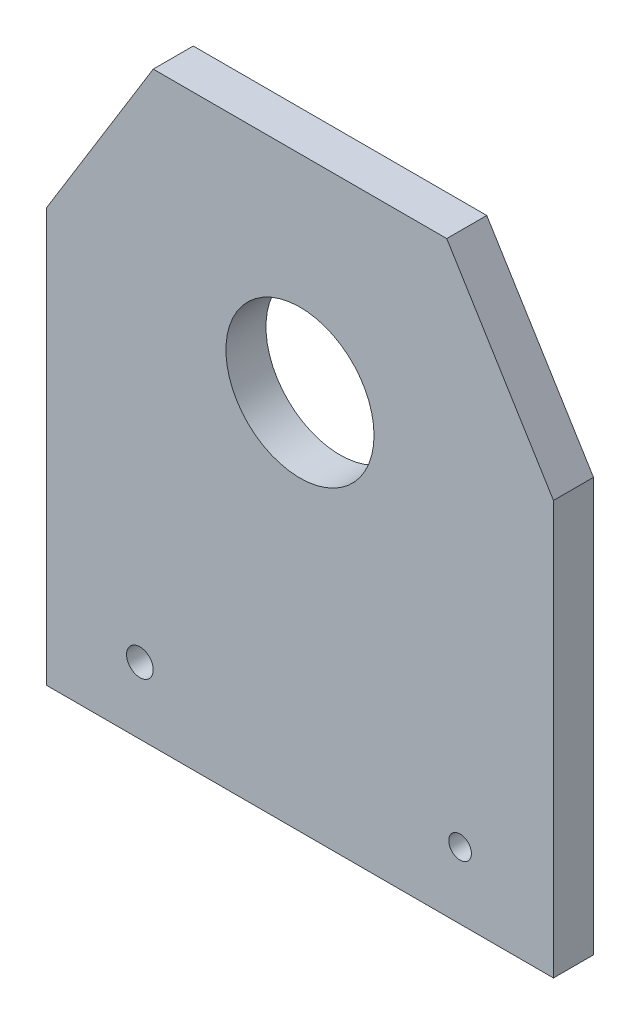
ISO-10303-21;
HEADER;
FILE_DESCRIPTION(('STEP AP214'),'2;1');
FILE_NAME('part.step','',(''),(''),'','','');
FILE_SCHEMA(('AUTOMOTIVE_DESIGN { 1 0 10303 214 1 1 1 1 }'));
ENDSEC;
DATA;
#1=APPLICATION_CONTEXT('core data for automotive mechanical design processes');
#2=APPLICATION_PROTOCOL_DEFINITION('international standard','automotive_design',2000,#1);
#3=PRODUCT_CONTEXT('',#1,'mechanical');
#4=PRODUCT('Part','Part','',(#3));
#5=PRODUCT_RELATED_PRODUCT_CATEGORY('part','',(#4));
#6=PRODUCT_DEFINITION_FORMATION('','',#4);
#7=PRODUCT_DEFINITION_CONTEXT('part definition',#1,'design');
#8=PRODUCT_DEFINITION('design','',#6,#7);
#9=PRODUCT_DEFINITION_SHAPE('','',#8);
#10=(LENGTH_UNIT() NAMED_UNIT(*) SI_UNIT(.MILLI.,.METRE.));
#11=(NAMED_UNIT(*) PLANE_ANGLE_UNIT() SI_UNIT($,.RADIAN.));
#12=(NAMED_UNIT(*) SI_UNIT($,.STERADIAN.) SOLID_ANGLE_UNIT());
#13=UNCERTAINTY_MEASURE_WITH_UNIT(LENGTH_MEASURE(1.E-05),#10,'distance_accuracy_value','');
#14=(GEOMETRIC_REPRESENTATION_CONTEXT(3) GLOBAL_UNCERTAINTY_ASSIGNED_CONTEXT((#13)) GLOBAL_UNIT_ASSIGNED_CONTEXT((#10,
#11,#12)) REPRESENTATION_CONTEXT('',''));
#15=CARTESIAN_POINT('',(0.,0.,0.));
#16=DIRECTION('',(0.,0.,1.));
#17=DIRECTION('',(1.,0.,0.));
#18=AXIS2_PLACEMENT_3D('',#15,#16,#17);
#19=CARTESIAN_POINT('',(0.,0.,6.));
#20=DIRECTION('',(0.,0.,1.));
#21=DIRECTION('',(1.,0.,0.));
#22=AXIS2_PLACEMENT_3D('',#19,#20,#21);
#23=PLANE('',#22);
#24=CARTESIAN_POINT('',(-24.,10.,6.));
#25=DIRECTION('',(0.,0.,1.));
#26=DIRECTION('',(1.,0.,0.));
#27=AXIS2_PLACEMENT_3D('',#24,#25,#26);
#28=CIRCLE('',#27,2.);
#29=CARTESIAN_POINT('',(-22.,10.,6.));
#30=VERTEX_POINT('',#29);
#31=EDGE_CURVE('E192',#30,#30,#28,.T.);
#32=ORIENTED_EDGE('',*,*,#31,.F.);
#33=EDGE_LOOP('',(#32));
#34=FACE_BOUND('',#33,.T.);
#35=DIRECTION('',(0.,-1.,0.));
#36=VECTOR('',#35,1.);
#37=CARTESIAN_POINT('',(-38.,62.,6.));
#38=LINE('',#37,#36);
#39=CARTESIAN_POINT('',(-38.,62.,6.));
#40=VERTEX_POINT('',#39);
#41=CARTESIAN_POINT('',(-38.,0.,6.));
#42=VERTEX_POINT('',#41);
#43=EDGE_CURVE('E137',#40,#42,#38,.T.);
#44=ORIENTED_EDGE('',*,*,#43,.T.);
#45=DIRECTION('',(1.,0.,0.));
#46=VECTOR('',#45,1.);
#47=CARTESIAN_POINT('',(-38.,0.,6.));
#48=LINE('',#47,#46);
#49=CARTESIAN_POINT('',(38.,0.,6.));
#50=VERTEX_POINT('',#49);
#51=EDGE_CURVE('E95',#42,#50,#48,.T.);
#52=ORIENTED_EDGE('',*,*,#51,.T.);
#53=DIRECTION('',(0.,1.,0.));
#54=VECTOR('',#53,1.);
#55=CARTESIAN_POINT('',(38.,0.,6.));
#56=LINE('',#55,#54);
#57=CARTESIAN_POINT('',(38.,62.,6.));
#58=VERTEX_POINT('',#57);
#59=EDGE_CURVE('E108',#50,#58,#56,.T.);
#60=ORIENTED_EDGE('',*,*,#59,.T.);
#61=DIRECTION('',(-0.524097425664335,0.851658316704544,0.));
#62=VECTOR('',#61,1.);
#63=CARTESIAN_POINT('',(38.,62.,6.));
#64=LINE('',#63,#62);
#65=CARTESIAN_POINT('',(22.,88.,6.));
#66=VERTEX_POINT('',#65);
#67=EDGE_CURVE('E102',#58,#66,#64,.T.);
#68=ORIENTED_EDGE('',*,*,#67,.T.);
#69=DIRECTION('',(-1.,0.,0.));
#70=VECTOR('',#69,1.);
#71=CARTESIAN_POINT('',(22.,88.,6.));
#72=LINE('',#71,#70);
#73=CARTESIAN_POINT('',(-22.,88.,6.));
#74=VERTEX_POINT('',#73);
#75=EDGE_CURVE('E106',#66,#74,#72,.T.);
#76=ORIENTED_EDGE('',*,*,#75,.T.);
#77=DIRECTION('',(-0.524097425664335,-0.851658316704544,0.));
#78=VECTOR('',#77,1.);
#79=CARTESIAN_POINT('',(-22.,88.,6.));
#80=LINE('',#79,#78);
#81=EDGE_CURVE('E58',#74,#40,#80,.T.);
#82=ORIENTED_EDGE('',*,*,#81,.T.);
#83=EDGE_LOOP('',(#44,#52,#60,#68,#76,#82));
#84=FACE_BOUND('',#83,.T.);
#85=CARTESIAN_POINT('',(0.,57.,6.));
#86=DIRECTION('',(0.,0.,1.));
#87=DIRECTION('',(1.,0.,0.));
#88=AXIS2_PLACEMENT_3D('',#85,#86,#87);
#89=CIRCLE('',#88,11.1);
#90=CARTESIAN_POINT('',(11.1,57.,6.));
#91=VERTEX_POINT('',#90);
#92=EDGE_CURVE('E130',#91,#91,#89,.T.);
#93=ORIENTED_EDGE('',*,*,#92,.F.);
#94=EDGE_LOOP('',(#93));
#95=FACE_BOUND('',#94,.T.);
#96=CARTESIAN_POINT('',(24.,10.,6.));
#97=DIRECTION('',(0.,0.,1.));
#98=DIRECTION('',(1.,0.,0.));
#99=AXIS2_PLACEMENT_3D('',#96,#97,#98);
#100=CIRCLE('',#99,1.7);
#101=CARTESIAN_POINT('',(25.7,10.,6.));
#102=VERTEX_POINT('',#101);
#103=EDGE_CURVE('E183',#102,#102,#100,.T.);
#104=ORIENTED_EDGE('',*,*,#103,.F.);
#105=EDGE_LOOP('',(#104));
#106=FACE_BOUND('',#105,.T.);
#107=ADVANCED_FACE('F41',(#34,#84,#95,#106),#23,.T.);
#108=CARTESIAN_POINT('',(0.,0.,0.));
#109=DIRECTION('',(0.,0.,1.));
#110=DIRECTION('',(1.,0.,0.));
#111=AXIS2_PLACEMENT_3D('',#108,#109,#110);
#112=PLANE('',#111);
#113=DIRECTION('',(0.,-1.,0.));
#114=VECTOR('',#113,1.);
#115=CARTESIAN_POINT('',(-38.,62.,0.));
#116=LINE('',#115,#114);
#117=CARTESIAN_POINT('',(-38.,62.,0.));
#118=VERTEX_POINT('',#117);
#119=CARTESIAN_POINT('',(-38.,0.,0.));
#120=VERTEX_POINT('',#119);
#121=EDGE_CURVE('E126',#118,#120,#116,.T.);
#122=ORIENTED_EDGE('',*,*,#121,.F.);
#123=DIRECTION('',(-0.524097425664335,-0.851658316704544,0.));
#124=VECTOR('',#123,1.);
#125=CARTESIAN_POINT('',(-22.,88.,0.));
#126=LINE('',#125,#124);
#127=CARTESIAN_POINT('',(-22.,88.,0.));
#128=VERTEX_POINT('',#127);
#129=EDGE_CURVE('E87',#128,#118,#126,.T.);
#130=ORIENTED_EDGE('',*,*,#129,.F.);
#131=DIRECTION('',(-1.,0.,0.));
#132=VECTOR('',#131,1.);
#133=CARTESIAN_POINT('',(22.,88.,0.));
#134=LINE('',#133,#132);
#135=CARTESIAN_POINT('',(22.,88.,0.));
#136=VERTEX_POINT('',#135);
#137=EDGE_CURVE('E81',#136,#128,#134,.T.);
#138=ORIENTED_EDGE('',*,*,#137,.F.);
#139=DIRECTION('',(-0.524097425664335,0.851658316704544,0.));
#140=VECTOR('',#139,1.);
#141=CARTESIAN_POINT('',(38.,62.,0.));
#142=LINE('',#141,#140);
#143=CARTESIAN_POINT('',(38.,62.,0.));
#144=VERTEX_POINT('',#143);
#145=EDGE_CURVE('E116',#144,#136,#142,.T.);
#146=ORIENTED_EDGE('',*,*,#145,.F.);
#147=DIRECTION('',(0.,1.,0.));
#148=VECTOR('',#147,1.);
#149=CARTESIAN_POINT('',(38.,0.,0.));
#150=LINE('',#149,#148);
#151=CARTESIAN_POINT('',(38.,0.,0.));
#152=VERTEX_POINT('',#151);
#153=EDGE_CURVE('E132',#152,#144,#150,.T.);
#154=ORIENTED_EDGE('',*,*,#153,.F.);
#155=DIRECTION('',(1.,0.,0.));
#156=VECTOR('',#155,1.);
#157=CARTESIAN_POINT('',(-38.,0.,0.));
#158=LINE('',#157,#156);
#159=EDGE_CURVE('E129',#120,#152,#158,.T.);
#160=ORIENTED_EDGE('',*,*,#159,.F.);
#161=EDGE_LOOP('',(#122,#130,#138,#146,#154,#160));
#162=FACE_BOUND('',#161,.T.);
#163=CARTESIAN_POINT('',(0.,57.,0.));
#164=DIRECTION('',(0.,0.,1.));
#165=DIRECTION('',(1.,0.,0.));
#166=AXIS2_PLACEMENT_3D('',#163,#164,#165);
#167=CIRCLE('',#166,11.1);
#168=CARTESIAN_POINT('',(11.1,57.,0.));
#169=VERTEX_POINT('',#168);
#170=EDGE_CURVE('E195',#169,#169,#167,.T.);
#171=ORIENTED_EDGE('',*,*,#170,.T.);
#172=EDGE_LOOP('',(#171));
#173=FACE_BOUND('',#172,.T.);
#174=CARTESIAN_POINT('',(-24.,10.,0.));
#175=DIRECTION('',(0.,0.,1.));
#176=DIRECTION('',(1.,0.,0.));
#177=AXIS2_PLACEMENT_3D('',#174,#175,#176);
#178=CIRCLE('',#177,2.);
#179=CARTESIAN_POINT('',(-22.,10.,0.));
#180=VERTEX_POINT('',#179);
#181=EDGE_CURVE('E189',#180,#180,#178,.T.);
#182=ORIENTED_EDGE('',*,*,#181,.T.);
#183=EDGE_LOOP('',(#182));
#184=FACE_BOUND('',#183,.T.);
#185=CARTESIAN_POINT('',(24.,10.,0.));
#186=DIRECTION('',(0.,0.,1.));
#187=DIRECTION('',(1.,0.,0.));
#188=AXIS2_PLACEMENT_3D('',#185,#186,#187);
#189=CIRCLE('',#188,1.7);
#190=CARTESIAN_POINT('',(25.7,10.,0.));
#191=VERTEX_POINT('',#190);
#192=EDGE_CURVE('E186',#191,#191,#189,.T.);
#193=ORIENTED_EDGE('',*,*,#192,.T.);
#194=EDGE_LOOP('',(#193));
#195=FACE_BOUND('',#194,.T.);
#196=ADVANCED_FACE('F146',(#162,#173,#184,#195),#112,.F.);
#197=CARTESIAN_POINT('',(-38.,62.,6.));
#198=DIRECTION('',(1.,0.,0.));
#199=DIRECTION('',(0.,0.,-1.));
#200=AXIS2_PLACEMENT_3D('',#197,#198,#199);
#201=PLANE('',#200);
#202=ORIENTED_EDGE('',*,*,#121,.T.);
#203=DIRECTION('',(0.,0.,-1.));
#204=VECTOR('',#203,1.);
#205=CARTESIAN_POINT('',(-38.,0.,6.));
#206=LINE('',#205,#204);
#207=EDGE_CURVE('E11',#42,#120,#206,.T.);
#208=ORIENTED_EDGE('',*,*,#207,.F.);
#209=ORIENTED_EDGE('',*,*,#43,.F.);
#210=DIRECTION('',(0.,0.,-1.));
#211=VECTOR('',#210,1.);
#212=CARTESIAN_POINT('',(-38.,62.,6.));
#213=LINE('',#212,#211);
#214=EDGE_CURVE('E122',#40,#118,#213,.T.);
#215=ORIENTED_EDGE('',*,*,#214,.T.);
#216=EDGE_LOOP('',(#202,#208,#209,#215));
#217=FACE_BOUND('',#216,.T.);
#218=ADVANCED_FACE('F43',(#217),#201,.F.);
#219=CARTESIAN_POINT('',(-38.,0.,6.));
#220=DIRECTION('',(0.,1.,0.));
#221=DIRECTION('',(0.,0.,1.));
#222=AXIS2_PLACEMENT_3D('',#219,#220,#221);
#223=PLANE('',#222);
#224=ORIENTED_EDGE('',*,*,#159,.T.);
#225=DIRECTION('',(0.,0.,-1.));
#226=VECTOR('',#225,1.);
#227=CARTESIAN_POINT('',(38.,0.,6.));
#228=LINE('',#227,#226);
#229=EDGE_CURVE('E50',#50,#152,#228,.T.);
#230=ORIENTED_EDGE('',*,*,#229,.F.);
#231=ORIENTED_EDGE('',*,*,#51,.F.);
#232=ORIENTED_EDGE('',*,*,#207,.T.);
#233=EDGE_LOOP('',(#224,#230,#231,#232));
#234=FACE_BOUND('',#233,.T.);
#235=ADVANCED_FACE('F248',(#234),#223,.F.);
#236=CARTESIAN_POINT('',(38.,0.,6.));
#237=DIRECTION('',(-1.,0.,0.));
#238=DIRECTION('',(0.,0.,1.));
#239=AXIS2_PLACEMENT_3D('',#236,#237,#238);
#240=PLANE('',#239);
#241=ORIENTED_EDGE('',*,*,#153,.T.);
#242=DIRECTION('',(0.,0.,-1.));
#243=VECTOR('',#242,1.);
#244=CARTESIAN_POINT('',(38.,62.,6.));
#245=LINE('',#244,#243);
#246=EDGE_CURVE('E117',#58,#144,#245,.T.);
#247=ORIENTED_EDGE('',*,*,#246,.F.);
#248=ORIENTED_EDGE('',*,*,#59,.F.);
#249=ORIENTED_EDGE('',*,*,#229,.T.);
#250=EDGE_LOOP('',(#241,#247,#248,#249));
#251=FACE_BOUND('',#250,.T.);
#252=ADVANCED_FACE('F143',(#251),#240,.F.);
#253=CARTESIAN_POINT('',(38.,62.,6.));
#254=DIRECTION('',(-0.851658316704544,-0.524097425664335,0.));
#255=DIRECTION('',(0.524097425664335,-0.851658316704544,0.));
#256=AXIS2_PLACEMENT_3D('',#253,#254,#255);
#257=PLANE('',#256);
#258=ORIENTED_EDGE('',*,*,#145,.T.);
#259=DIRECTION('',(0.,0.,-1.));
#260=VECTOR('',#259,1.);
#261=CARTESIAN_POINT('',(22.,88.,6.));
#262=LINE('',#261,#260);
#263=EDGE_CURVE('E113',#66,#136,#262,.T.);
#264=ORIENTED_EDGE('',*,*,#263,.F.);
#265=ORIENTED_EDGE('',*,*,#67,.F.);
#266=ORIENTED_EDGE('',*,*,#246,.T.);
#267=EDGE_LOOP('',(#258,#264,#265,#266));
#268=FACE_BOUND('',#267,.T.);
#269=ADVANCED_FACE('F114',(#268),#257,.F.);
#270=CARTESIAN_POINT('',(22.,88.,6.));
#271=DIRECTION('',(0.,-1.,0.));
#272=DIRECTION('',(0.,0.,-1.));
#273=AXIS2_PLACEMENT_3D('',#270,#271,#272);
#274=PLANE('',#273);
#275=ORIENTED_EDGE('',*,*,#137,.T.);
#276=DIRECTION('',(0.,0.,-1.));
#277=VECTOR('',#276,1.);
#278=CARTESIAN_POINT('',(-22.,88.,6.));
#279=LINE('',#278,#277);
#280=EDGE_CURVE('E118',#74,#128,#279,.T.);
#281=ORIENTED_EDGE('',*,*,#280,.F.);
#282=ORIENTED_EDGE('',*,*,#75,.F.);
#283=ORIENTED_EDGE('',*,*,#263,.T.);
#284=EDGE_LOOP('',(#275,#281,#282,#283));
#285=FACE_BOUND('',#284,.T.);
#286=ADVANCED_FACE('F120',(#285),#274,.F.);
#287=CARTESIAN_POINT('',(-22.,88.,6.));
#288=DIRECTION('',(0.851658316704544,-0.524097425664335,0.));
#289=DIRECTION('',(0.524097425664335,0.851658316704544,0.));
#290=AXIS2_PLACEMENT_3D('',#287,#288,#289);
#291=PLANE('',#290);
#292=ORIENTED_EDGE('',*,*,#129,.T.);
#293=ORIENTED_EDGE('',*,*,#214,.F.);
#294=ORIENTED_EDGE('',*,*,#81,.F.);
#295=ORIENTED_EDGE('',*,*,#280,.T.);
#296=EDGE_LOOP('',(#292,#293,#294,#295));
#297=FACE_BOUND('',#296,.T.);
#298=ADVANCED_FACE('F151',(#297),#291,.F.);
#299=CARTESIAN_POINT('',(0.,57.,6.));
#300=DIRECTION('',(0.,0.,-1.));
#301=DIRECTION('',(-1.,0.,0.));
#302=AXIS2_PLACEMENT_3D('',#299,#300,#301);
#303=CYLINDRICAL_SURFACE('',#302,11.1);
#304=ORIENTED_EDGE('',*,*,#92,.T.);
#305=EDGE_LOOP('',(#304));
#306=FACE_BOUND('',#305,.T.);
#307=ORIENTED_EDGE('',*,*,#170,.F.);
#308=EDGE_LOOP('',(#307));
#309=FACE_BOUND('',#308,.T.);
#310=ADVANCED_FACE('F153',(#306,#309),#303,.F.);
#311=CARTESIAN_POINT('',(-24.,10.,6.));
#312=DIRECTION('',(0.,0.,-1.));
#313=DIRECTION('',(-1.,0.,0.));
#314=AXIS2_PLACEMENT_3D('',#311,#312,#313);
#315=CYLINDRICAL_SURFACE('',#314,2.);
#316=ORIENTED_EDGE('',*,*,#31,.T.);
#317=EDGE_LOOP('',(#316));
#318=FACE_BOUND('',#317,.T.);
#319=ORIENTED_EDGE('',*,*,#181,.F.);
#320=EDGE_LOOP('',(#319));
#321=FACE_BOUND('',#320,.T.);
#322=ADVANCED_FACE('F159',(#318,#321),#315,.F.);
#323=CARTESIAN_POINT('',(24.,10.,6.));
#324=DIRECTION('',(0.,0.,-1.));
#325=DIRECTION('',(-1.,0.,0.));
#326=AXIS2_PLACEMENT_3D('',#323,#324,#325);
#327=CYLINDRICAL_SURFACE('',#326,1.7);
#328=ORIENTED_EDGE('',*,*,#103,.T.);
#329=EDGE_LOOP('',(#328));
#330=FACE_BOUND('',#329,.T.);
#331=ORIENTED_EDGE('',*,*,#192,.F.);
#332=EDGE_LOOP('',(#331));
#333=FACE_BOUND('',#332,.T.);
#334=ADVANCED_FACE('F174',(#330,#333),#327,.F.);
#335=CLOSED_SHELL('',(#107,#196,#218,#235,#252,#269,#286,#298,#310,#322,#334));
#336=MANIFOLD_SOLID_BREP('B2',#335);
#337=ADVANCED_BREP_SHAPE_REPRESENTATION('',(#18,#336),#14);
#338=SHAPE_DEFINITION_REPRESENTATION(#9,#337);
ENDSEC;
END-ISO-10303-21;
